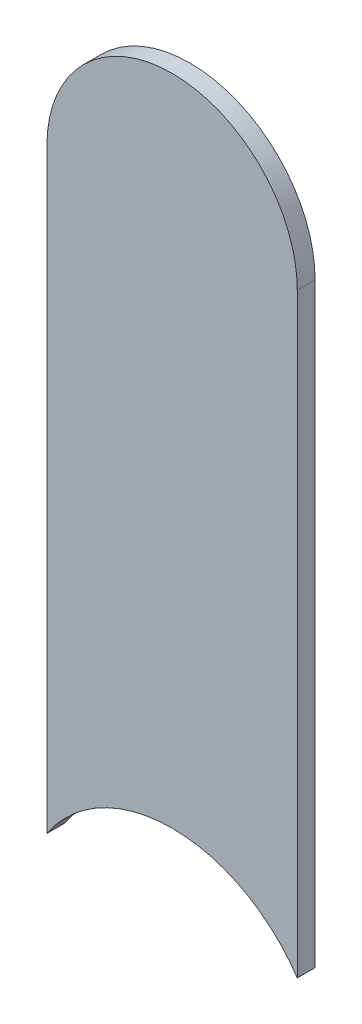
ISO-10303-21;
HEADER;
FILE_DESCRIPTION(('STEP AP214'),'2;1');
FILE_NAME('part.step','',(''),(''),'','','');
FILE_SCHEMA(('AUTOMOTIVE_DESIGN { 1 0 10303 214 1 1 1 1 }'));
ENDSEC;
DATA;
#1=APPLICATION_CONTEXT('core data for automotive mechanical design processes');
#2=APPLICATION_PROTOCOL_DEFINITION('international standard','automotive_design',2000,#1);
#3=PRODUCT_CONTEXT('',#1,'mechanical');
#4=PRODUCT('Part','Part','',(#3));
#5=PRODUCT_RELATED_PRODUCT_CATEGORY('part','',(#4));
#6=PRODUCT_DEFINITION_FORMATION('','',#4);
#7=PRODUCT_DEFINITION_CONTEXT('part definition',#1,'design');
#8=PRODUCT_DEFINITION('design','',#6,#7);
#9=PRODUCT_DEFINITION_SHAPE('','',#8);
#10=(LENGTH_UNIT() NAMED_UNIT(*) SI_UNIT(.MILLI.,.METRE.));
#11=(NAMED_UNIT(*) PLANE_ANGLE_UNIT() SI_UNIT($,.RADIAN.));
#12=(NAMED_UNIT(*) SI_UNIT($,.STERADIAN.) SOLID_ANGLE_UNIT());
#13=UNCERTAINTY_MEASURE_WITH_UNIT(LENGTH_MEASURE(1.E-05),#10,'distance_accuracy_value','');
#14=(GEOMETRIC_REPRESENTATION_CONTEXT(3) GLOBAL_UNCERTAINTY_ASSIGNED_CONTEXT((#13)) GLOBAL_UNIT_ASSIGNED_CONTEXT((#10,
#11,#12)) REPRESENTATION_CONTEXT('',''));
#15=CARTESIAN_POINT('',(0.,0.,0.));
#16=DIRECTION('',(0.,0.,1.));
#17=DIRECTION('',(1.,0.,0.));
#18=AXIS2_PLACEMENT_3D('',#15,#16,#17);
#19=CARTESIAN_POINT('',(115.0900035,113.465832907855,0.));
#20=DIRECTION('',(-1.,0.,0.));
#21=DIRECTION('',(0.,1.,0.));
#22=AXIS2_PLACEMENT_3D('',#19,#20,#21);
#23=PLANE('',#22);
#24=DIRECTION('',(0.,1.,0.));
#25=VECTOR('',#24,1.);
#26=CARTESIAN_POINT('',(115.0900035,113.300002,0.03556));
#27=LINE('',#26,#25);
#28=CARTESIAN_POINT('',(115.0900035,113.465832907855,0.03556));
#29=VERTEX_POINT('',#28);
#30=CARTESIAN_POINT('',(115.0900035,114.6556,0.03556));
#31=VERTEX_POINT('',#30);
#32=EDGE_CURVE('E11',#29,#31,#27,.T.);
#33=ORIENTED_EDGE('',*,*,#32,.F.);
#34=DIRECTION('',(0.,0.,1.));
#35=VECTOR('',#34,1.);
#36=CARTESIAN_POINT('',(115.0900035,113.465832907855,0.));
#37=LINE('',#36,#35);
#38=CARTESIAN_POINT('',(115.0900035,113.465832907855,0.));
#39=VERTEX_POINT('',#38);
#40=EDGE_CURVE('E24',#39,#29,#37,.T.);
#41=ORIENTED_EDGE('',*,*,#40,.F.);
#42=DIRECTION('',(0.,1.,0.));
#43=VECTOR('',#42,1.);
#44=CARTESIAN_POINT('',(115.0900035,113.300002,0.));
#45=LINE('',#44,#43);
#46=CARTESIAN_POINT('',(115.0900035,114.6556,0.));
#47=VERTEX_POINT('',#46);
#48=EDGE_CURVE('E75',#39,#47,#45,.T.);
#49=ORIENTED_EDGE('',*,*,#48,.T.);
#50=DIRECTION('',(0.,0.,1.));
#51=VECTOR('',#50,1.);
#52=CARTESIAN_POINT('',(115.0900035,114.6556,0.));
#53=LINE('',#52,#51);
#54=EDGE_CURVE('E37',#47,#31,#53,.T.);
#55=ORIENTED_EDGE('',*,*,#54,.T.);
#56=EDGE_LOOP('',(#33,#41,#49,#55));
#57=FACE_BOUND('',#56,.T.);
#58=ADVANCED_FACE('F17',(#57),#23,.F.);
#59=CARTESIAN_POINT('',(114.840004,114.6556,0.));
#60=DIRECTION('',(0.,0.,-1.));
#61=DIRECTION('',(1.,1.13687065095746E-13,0.));
#62=AXIS2_PLACEMENT_3D('',#59,#60,#61);
#63=CYLINDRICAL_SURFACE('',#62,0.249999500000006);
#64=CARTESIAN_POINT('',(114.840004,114.6556,0.03556));
#65=DIRECTION('',(0.,0.,1.));
#66=DIRECTION('',(1.,1.13687065095746E-13,0.));
#67=AXIS2_PLACEMENT_3D('',#64,#65,#66);
#68=CIRCLE('',#67,0.249999500000006);
#69=CARTESIAN_POINT('',(114.5900045,114.6556,0.03556));
#70=VERTEX_POINT('',#69);
#71=EDGE_CURVE('E83',#31,#70,#68,.T.);
#72=ORIENTED_EDGE('',*,*,#71,.F.);
#73=ORIENTED_EDGE('',*,*,#54,.F.);
#74=CARTESIAN_POINT('',(114.840004,114.6556,0.));
#75=DIRECTION('',(0.,0.,1.));
#76=DIRECTION('',(1.,1.13687065095746E-13,0.));
#77=AXIS2_PLACEMENT_3D('',#74,#75,#76);
#78=CIRCLE('',#77,0.249999500000006);
#79=CARTESIAN_POINT('',(114.5900045,114.6556,0.));
#80=VERTEX_POINT('',#79);
#81=EDGE_CURVE('E81',#47,#80,#78,.T.);
#82=ORIENTED_EDGE('',*,*,#81,.T.);
#83=DIRECTION('',(0.,0.,1.));
#84=VECTOR('',#83,1.);
#85=CARTESIAN_POINT('',(114.5900045,114.6556,0.));
#86=LINE('',#85,#84);
#87=EDGE_CURVE('E67',#80,#70,#86,.T.);
#88=ORIENTED_EDGE('',*,*,#87,.T.);
#89=EDGE_LOOP('',(#72,#73,#82,#88));
#90=FACE_BOUND('',#89,.T.);
#91=ADVANCED_FACE('F89',(#90),#63,.T.);
#92=CARTESIAN_POINT('',(114.5900045,114.6556,0.));
#93=DIRECTION('',(1.,0.,0.));
#94=DIRECTION('',(0.,-1.,0.));
#95=AXIS2_PLACEMENT_3D('',#92,#93,#94);
#96=PLANE('',#95);
#97=DIRECTION('',(0.,-1.,0.));
#98=VECTOR('',#97,1.);
#99=CARTESIAN_POINT('',(114.5900045,114.6556,0.03556));
#100=LINE('',#99,#98);
#101=CARTESIAN_POINT('',(114.5900045,113.465832907855,0.03556));
#102=VERTEX_POINT('',#101);
#103=EDGE_CURVE('E71',#70,#102,#100,.T.);
#104=ORIENTED_EDGE('',*,*,#103,.F.);
#105=ORIENTED_EDGE('',*,*,#87,.F.);
#106=DIRECTION('',(0.,-1.,0.));
#107=VECTOR('',#106,1.);
#108=CARTESIAN_POINT('',(114.5900045,114.6556,0.));
#109=LINE('',#108,#107);
#110=CARTESIAN_POINT('',(114.5900045,113.465832907855,0.));
#111=VERTEX_POINT('',#110);
#112=EDGE_CURVE('E63',#80,#111,#109,.T.);
#113=ORIENTED_EDGE('',*,*,#112,.T.);
#114=DIRECTION('',(0.,0.,1.));
#115=VECTOR('',#114,1.);
#116=CARTESIAN_POINT('',(114.5900045,113.465832907855,0.));
#117=LINE('',#116,#115);
#118=EDGE_CURVE('E53',#111,#102,#117,.T.);
#119=ORIENTED_EDGE('',*,*,#118,.T.);
#120=EDGE_LOOP('',(#104,#105,#113,#119));
#121=FACE_BOUND('',#120,.T.);
#122=ADVANCED_FACE('F66',(#121),#96,.F.);
#123=CARTESIAN_POINT('',(114.840004,113.300002,0.));
#124=DIRECTION('',(0.,0.,-1.));
#125=DIRECTION('',(1.,0.,0.));
#126=AXIS2_PLACEMENT_3D('',#123,#124,#125);
#127=CYLINDRICAL_SURFACE('',#126,0.2999994);
#128=ORIENTED_EDGE('',*,*,#40,.T.);
#129=CARTESIAN_POINT('',(114.840004,113.300002,0.03556));
#130=DIRECTION('',(0.,0.,1.));
#131=DIRECTION('',(1.,0.,0.));
#132=AXIS2_PLACEMENT_3D('',#129,#130,#131);
#133=CIRCLE('',#132,0.2999994);
#134=EDGE_CURVE('E59',#29,#102,#133,.T.);
#135=ORIENTED_EDGE('',*,*,#134,.T.);
#136=ORIENTED_EDGE('',*,*,#118,.F.);
#137=CARTESIAN_POINT('',(114.840004,113.300002,0.));
#138=DIRECTION('',(0.,0.,1.));
#139=DIRECTION('',(1.,0.,0.));
#140=AXIS2_PLACEMENT_3D('',#137,#138,#139);
#141=CIRCLE('',#140,0.2999994);
#142=EDGE_CURVE('E57',#39,#111,#141,.T.);
#143=ORIENTED_EDGE('',*,*,#142,.F.);
#144=EDGE_LOOP('',(#128,#135,#136,#143));
#145=FACE_BOUND('',#144,.T.);
#146=ADVANCED_FACE('F55',(#145),#127,.F.);
#147=CARTESIAN_POINT('',(115.0900035,113.300002,0.));
#148=DIRECTION('',(0.,0.,-1.));
#149=DIRECTION('',(-1.,0.,0.));
#150=AXIS2_PLACEMENT_3D('',#147,#148,#149);
#151=PLANE('',#150);
#152=ORIENTED_EDGE('',*,*,#48,.F.);
#153=ORIENTED_EDGE('',*,*,#142,.T.);
#154=ORIENTED_EDGE('',*,*,#112,.F.);
#155=ORIENTED_EDGE('',*,*,#81,.F.);
#156=EDGE_LOOP('',(#152,#153,#154,#155));
#157=FACE_BOUND('',#156,.T.);
#158=ADVANCED_FACE('F74',(#157),#151,.T.);
#159=CARTESIAN_POINT('',(115.0900035,113.300002,0.03556));
#160=DIRECTION('',(0.,0.,-1.));
#161=DIRECTION('',(-1.,0.,0.));
#162=AXIS2_PLACEMENT_3D('',#159,#160,#161);
#163=PLANE('',#162);
#164=ORIENTED_EDGE('',*,*,#134,.F.);
#165=ORIENTED_EDGE('',*,*,#32,.T.);
#166=ORIENTED_EDGE('',*,*,#71,.T.);
#167=ORIENTED_EDGE('',*,*,#103,.T.);
#168=EDGE_LOOP('',(#164,#165,#166,#167));
#169=FACE_BOUND('',#168,.T.);
#170=ADVANCED_FACE('F91',(#169),#163,.F.);
#171=CLOSED_SHELL('',(#58,#91,#122,#146,#158,#170));
#172=MANIFOLD_SOLID_BREP('B1',#171);
#173=ADVANCED_BREP_SHAPE_REPRESENTATION('',(#18,#172),#14);
#174=SHAPE_DEFINITION_REPRESENTATION(#9,#173);
ENDSEC;
END-ISO-10303-21;
